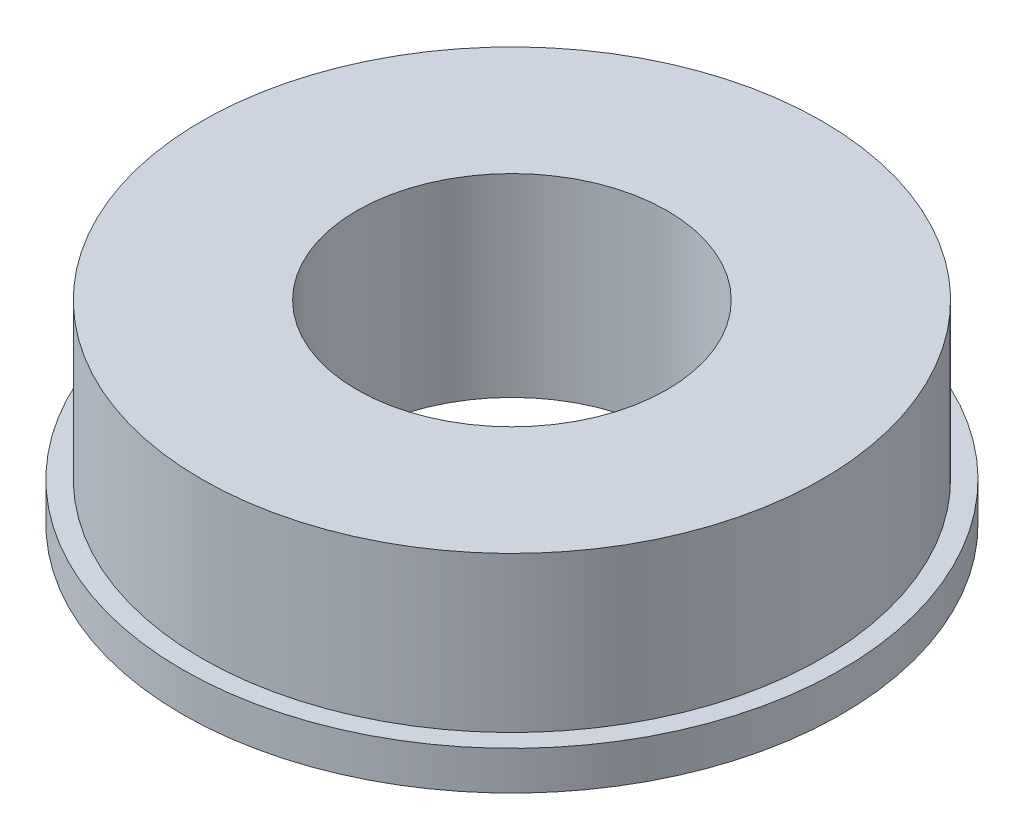
ISO-10303-21;
HEADER;
FILE_DESCRIPTION(('STEP AP214'),'2;1');
FILE_NAME('part.step','',(''),(''),'','','');
FILE_SCHEMA(('AUTOMOTIVE_DESIGN { 1 0 10303 214 1 1 1 1 }'));
ENDSEC;
DATA;
#1=APPLICATION_CONTEXT('core data for automotive mechanical design processes');
#2=APPLICATION_PROTOCOL_DEFINITION('international standard','automotive_design',2000,#1);
#3=PRODUCT_CONTEXT('',#1,'mechanical');
#4=PRODUCT('Part','Part','',(#3));
#5=PRODUCT_RELATED_PRODUCT_CATEGORY('part','',(#4));
#6=PRODUCT_DEFINITION_FORMATION('','',#4);
#7=PRODUCT_DEFINITION_CONTEXT('part definition',#1,'design');
#8=PRODUCT_DEFINITION('design','',#6,#7);
#9=PRODUCT_DEFINITION_SHAPE('','',#8);
#10=(LENGTH_UNIT() NAMED_UNIT(*) SI_UNIT(.MILLI.,.METRE.));
#11=(NAMED_UNIT(*) PLANE_ANGLE_UNIT() SI_UNIT($,.RADIAN.));
#12=(NAMED_UNIT(*) SI_UNIT($,.STERADIAN.) SOLID_ANGLE_UNIT());
#13=UNCERTAINTY_MEASURE_WITH_UNIT(LENGTH_MEASURE(1.E-05),#10,'distance_accuracy_value','');
#14=(GEOMETRIC_REPRESENTATION_CONTEXT(3) GLOBAL_UNCERTAINTY_ASSIGNED_CONTEXT((#13)) GLOBAL_UNIT_ASSIGNED_CONTEXT((#10,
#11,#12)) REPRESENTATION_CONTEXT('',''));
#15=CARTESIAN_POINT('',(0.,0.,0.));
#16=DIRECTION('',(0.,0.,1.));
#17=DIRECTION('',(1.,0.,0.));
#18=AXIS2_PLACEMENT_3D('',#15,#16,#17);
#19=CARTESIAN_POINT('',(0.,1.,0.));
#20=DIRECTION('',(0.,1.,0.));
#21=DIRECTION('',(0.,0.,1.));
#22=AXIS2_PLACEMENT_3D('',#19,#20,#21);
#23=PLANE('',#22);
#24=CARTESIAN_POINT('',(0.,1.,0.));
#25=DIRECTION('',(0.,1.,0.));
#26=DIRECTION('',(0.,0.,1.));
#27=AXIS2_PLACEMENT_3D('',#24,#25,#26);
#28=CIRCLE('',#27,8.);
#29=CARTESIAN_POINT('',(0.,1.,8.));
#30=VERTEX_POINT('',#29);
#31=EDGE_CURVE('E10',#30,#30,#28,.T.);
#32=ORIENTED_EDGE('',*,*,#31,.F.);
#33=EDGE_LOOP('',(#32));
#34=FACE_BOUND('',#33,.T.);
#35=CARTESIAN_POINT('',(0.,1.,0.));
#36=DIRECTION('',(0.,1.,0.));
#37=DIRECTION('',(0.,0.,1.));
#38=AXIS2_PLACEMENT_3D('',#35,#36,#37);
#39=CIRCLE('',#38,8.5);
#40=CARTESIAN_POINT('',(0.,1.,8.5));
#41=VERTEX_POINT('',#40);
#42=EDGE_CURVE('E41',#41,#41,#39,.T.);
#43=ORIENTED_EDGE('',*,*,#42,.T.);
#44=EDGE_LOOP('',(#43));
#45=FACE_BOUND('',#44,.T.);
#46=ADVANCED_FACE('F33',(#34,#45),#23,.T.);
#47=CARTESIAN_POINT('',(0.,0.,0.));
#48=DIRECTION('',(0.,1.,0.));
#49=DIRECTION('',(0.,0.,1.));
#50=AXIS2_PLACEMENT_3D('',#47,#48,#49);
#51=PLANE('',#50);
#52=CARTESIAN_POINT('',(0.,0.,0.));
#53=DIRECTION('',(0.,1.,0.));
#54=DIRECTION('',(0.,0.,1.));
#55=AXIS2_PLACEMENT_3D('',#52,#53,#54);
#56=CIRCLE('',#55,8.5);
#57=CARTESIAN_POINT('',(0.,0.,8.5));
#58=VERTEX_POINT('',#57);
#59=EDGE_CURVE('E37',#58,#58,#56,.T.);
#60=ORIENTED_EDGE('',*,*,#59,.F.);
#61=EDGE_LOOP('',(#60));
#62=FACE_BOUND('',#61,.T.);
#63=CARTESIAN_POINT('',(0.,0.,0.));
#64=DIRECTION('',(0.,1.,0.));
#65=DIRECTION('',(0.,0.,1.));
#66=AXIS2_PLACEMENT_3D('',#63,#64,#65);
#67=CIRCLE('',#66,4.);
#68=CARTESIAN_POINT('',(0.,0.,4.));
#69=VERTEX_POINT('',#68);
#70=EDGE_CURVE('E50',#69,#69,#67,.T.);
#71=ORIENTED_EDGE('',*,*,#70,.T.);
#72=EDGE_LOOP('',(#71));
#73=FACE_BOUND('',#72,.T.);
#74=ADVANCED_FACE('F77',(#62,#73),#51,.F.);
#75=CARTESIAN_POINT('',(0.,1.,0.));
#76=DIRECTION('',(0.,-1.,0.));
#77=DIRECTION('',(0.,0.,-1.));
#78=AXIS2_PLACEMENT_3D('',#75,#76,#77);
#79=CYLINDRICAL_SURFACE('',#78,8.5);
#80=ORIENTED_EDGE('',*,*,#42,.F.);
#81=EDGE_LOOP('',(#80));
#82=FACE_BOUND('',#81,.T.);
#83=ORIENTED_EDGE('',*,*,#59,.T.);
#84=EDGE_LOOP('',(#83));
#85=FACE_BOUND('',#84,.T.);
#86=ADVANCED_FACE('F35',(#82,#85),#79,.T.);
#87=CARTESIAN_POINT('',(0.,1.,0.));
#88=DIRECTION('',(0.,-1.,0.));
#89=DIRECTION('',(0.,0.,-1.));
#90=AXIS2_PLACEMENT_3D('',#87,#88,#89);
#91=CYLINDRICAL_SURFACE('',#90,4.);
#92=ORIENTED_EDGE('',*,*,#70,.F.);
#93=EDGE_LOOP('',(#92));
#94=FACE_BOUND('',#93,.T.);
#95=CARTESIAN_POINT('',(0.,5.,0.));
#96=DIRECTION('',(0.,1.,0.));
#97=DIRECTION('',(0.,0.,1.));
#98=AXIS2_PLACEMENT_3D('',#95,#96,#97);
#99=CIRCLE('',#98,4.);
#100=CARTESIAN_POINT('',(0.,5.,4.));
#101=VERTEX_POINT('',#100);
#102=EDGE_CURVE('E56',#101,#101,#99,.T.);
#103=ORIENTED_EDGE('',*,*,#102,.T.);
#104=EDGE_LOOP('',(#103));
#105=FACE_BOUND('',#104,.T.);
#106=ADVANCED_FACE('F62',(#94,#105),#91,.F.);
#107=CARTESIAN_POINT('',(0.,5.,0.));
#108=DIRECTION('',(0.,1.,0.));
#109=DIRECTION('',(0.,0.,1.));
#110=AXIS2_PLACEMENT_3D('',#107,#108,#109);
#111=PLANE('',#110);
#112=CARTESIAN_POINT('',(0.,5.,0.));
#113=DIRECTION('',(0.,1.,0.));
#114=DIRECTION('',(0.,0.,1.));
#115=AXIS2_PLACEMENT_3D('',#112,#113,#114);
#116=CIRCLE('',#115,8.);
#117=CARTESIAN_POINT('',(0.,5.,8.));
#118=VERTEX_POINT('',#117);
#119=EDGE_CURVE('E48',#118,#118,#116,.T.);
#120=ORIENTED_EDGE('',*,*,#119,.T.);
#121=EDGE_LOOP('',(#120));
#122=FACE_BOUND('',#121,.T.);
#123=ORIENTED_EDGE('',*,*,#102,.F.);
#124=EDGE_LOOP('',(#123));
#125=FACE_BOUND('',#124,.T.);
#126=ADVANCED_FACE('F64',(#122,#125),#111,.T.);
#127=CARTESIAN_POINT('',(0.,5.,0.));
#128=DIRECTION('',(0.,-1.,0.));
#129=DIRECTION('',(0.,0.,-1.));
#130=AXIS2_PLACEMENT_3D('',#127,#128,#129);
#131=CYLINDRICAL_SURFACE('',#130,8.);
#132=ORIENTED_EDGE('',*,*,#119,.F.);
#133=EDGE_LOOP('',(#132));
#134=FACE_BOUND('',#133,.T.);
#135=ORIENTED_EDGE('',*,*,#31,.T.);
#136=EDGE_LOOP('',(#135));
#137=FACE_BOUND('',#136,.T.);
#138=ADVANCED_FACE('F66',(#134,#137),#131,.T.);
#139=CLOSED_SHELL('',(#46,#74,#86,#106,#126,#138));
#140=MANIFOLD_SOLID_BREP('B2',#139);
#141=ADVANCED_BREP_SHAPE_REPRESENTATION('',(#18,#140),#14);
#142=SHAPE_DEFINITION_REPRESENTATION(#9,#141);
ENDSEC;
END-ISO-10303-21;
